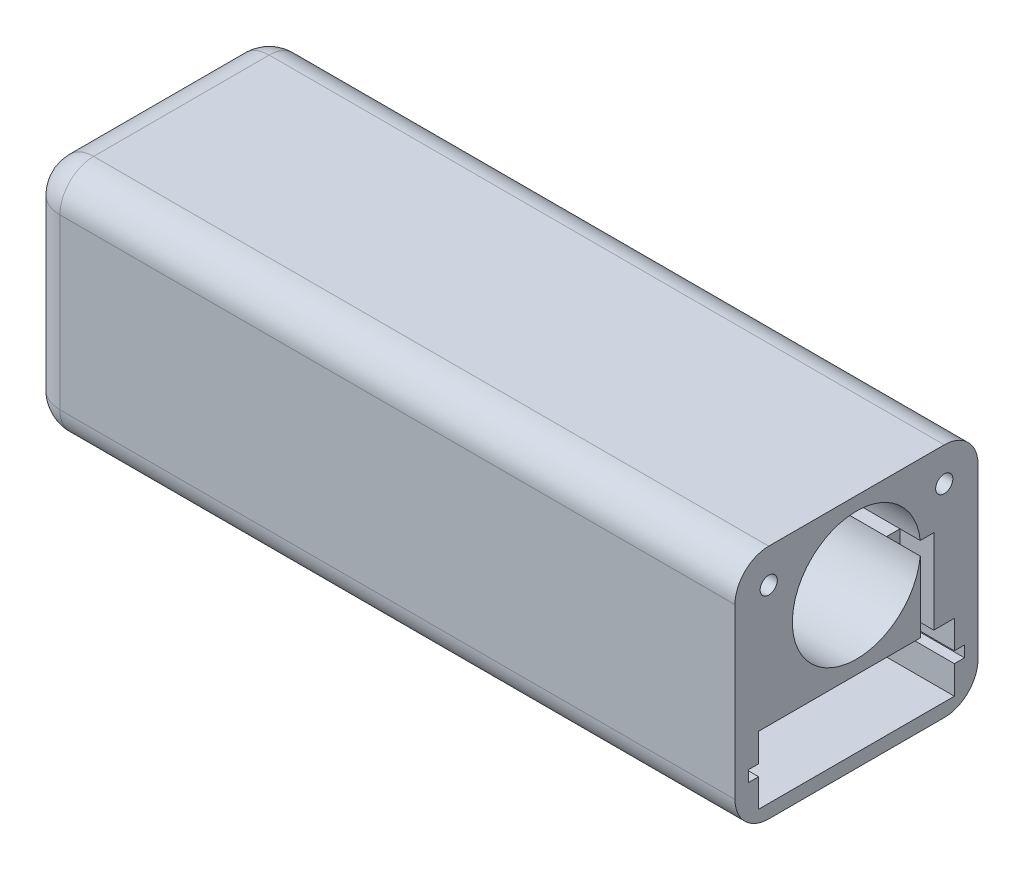
ISO-10303-21;
HEADER;
FILE_DESCRIPTION(('STEP AP214'),'2;1');
FILE_NAME('part.step','',(''),(''),'','','');
FILE_SCHEMA(('AUTOMOTIVE_DESIGN { 1 0 10303 214 1 1 1 1 }'));
ENDSEC;
DATA;
#1=APPLICATION_CONTEXT('core data for automotive mechanical design processes');
#2=APPLICATION_PROTOCOL_DEFINITION('international standard','automotive_design',2000,#1);
#3=PRODUCT_CONTEXT('',#1,'mechanical');
#4=PRODUCT('Part','Part','',(#3));
#5=PRODUCT_RELATED_PRODUCT_CATEGORY('part','',(#4));
#6=PRODUCT_DEFINITION_FORMATION('','',#4);
#7=PRODUCT_DEFINITION_CONTEXT('part definition',#1,'design');
#8=PRODUCT_DEFINITION('design','',#6,#7);
#9=PRODUCT_DEFINITION_SHAPE('','',#8);
#10=(LENGTH_UNIT() NAMED_UNIT(*) SI_UNIT(.MILLI.,.METRE.));
#11=(NAMED_UNIT(*) PLANE_ANGLE_UNIT() SI_UNIT($,.RADIAN.));
#12=(NAMED_UNIT(*) SI_UNIT($,.STERADIAN.) SOLID_ANGLE_UNIT());
#13=UNCERTAINTY_MEASURE_WITH_UNIT(LENGTH_MEASURE(1.E-05),#10,'distance_accuracy_value','');
#14=(GEOMETRIC_REPRESENTATION_CONTEXT(3) GLOBAL_UNCERTAINTY_ASSIGNED_CONTEXT((#13)) GLOBAL_UNIT_ASSIGNED_CONTEXT((#10,
#11,#12)) REPRESENTATION_CONTEXT('',''));
#15=CARTESIAN_POINT('',(0.,0.,0.));
#16=DIRECTION('',(0.,0.,1.));
#17=DIRECTION('',(1.,0.,0.));
#18=AXIS2_PLACEMENT_3D('',#15,#16,#17);
#19=CARTESIAN_POINT('',(105.,0.,0.));
#20=DIRECTION('',(1.,0.,0.));
#21=DIRECTION('',(0.,0.,-1.));
#22=AXIS2_PLACEMENT_3D('',#19,#20,#21);
#23=PLANE('',#22);
#24=CARTESIAN_POINT('',(105.,30.,-5.));
#25=DIRECTION('',(1.,0.,0.));
#26=DIRECTION('',(0.,0.,-1.));
#27=AXIS2_PLACEMENT_3D('',#24,#25,#26);
#28=CIRCLE('',#27,1.27);
#29=CARTESIAN_POINT('',(105.,30.,-6.27));
#30=VERTEX_POINT('',#29);
#31=EDGE_CURVE('E243',#30,#30,#28,.F.);
#32=ORIENTED_EDGE('',*,*,#31,.T.);
#33=EDGE_LOOP('',(#32));
#34=FACE_BOUND('',#33,.T.);
#35=DIRECTION('',(0.,-1.,0.));
#36=VECTOR('',#35,1.);
#37=CARTESIAN_POINT('',(105.,-291558.,-3.50000000003092));
#38=LINE('',#37,#36);
#39=CARTESIAN_POINT('',(105.,11.9999999999825,-3.49999999997408));
#40=VERTEX_POINT('',#39);
#41=CARTESIAN_POINT('',(105.,7.82500000002528,-3.49999999995506));
#42=VERTEX_POINT('',#41);
#43=EDGE_CURVE('E218',#40,#42,#38,.T.);
#44=ORIENTED_EDGE('',*,*,#43,.F.);
#45=DIRECTION('',(0.,0.,-1.));
#46=VECTOR('',#45,1.);
#47=CARTESIAN_POINT('',(105.,11.9999999998868,399982.));
#48=LINE('',#47,#46);
#49=CARTESIAN_POINT('',(105.,11.9999999999769,-27.4472218138726));
#50=VERTEX_POINT('',#49);
#51=EDGE_CURVE('E250',#40,#50,#48,.T.);
#52=ORIENTED_EDGE('',*,*,#51,.T.);
#53=DIRECTION('',(0.,-1.,0.));
#54=VECTOR('',#53,1.);
#55=CARTESIAN_POINT('',(105.,-291529.132234033,-27.4472218138726));
#56=LINE('',#55,#54);
#57=CARTESIAN_POINT('',(105.,22.4999999999795,-27.4472218138726));
#58=VERTEX_POINT('',#57);
#59=EDGE_CURVE('E51',#58,#50,#56,.T.);
#60=ORIENTED_EDGE('',*,*,#59,.F.);
#61=CARTESIAN_POINT('',(105.,23.4999999999825,-18.0000000000007));
#62=DIRECTION('',(1.,0.,0.));
#63=DIRECTION('',(0.,0.,-1.));
#64=AXIS2_PLACEMENT_3D('',#61,#62,#63);
#65=CIRCLE('',#64,9.50000000000909);
#66=CARTESIAN_POINT('',(105.,24.4999999999891,-27.4472218138726));
#67=VERTEX_POINT('',#66);
#68=EDGE_CURVE('E202',#67,#58,#65,.T.);
#69=ORIENTED_EDGE('',*,*,#68,.F.);
#70=DIRECTION('',(0.,0.,-1.));
#71=VECTOR('',#70,1.);
#72=CARTESIAN_POINT('',(105.,24.4999999999891,399982.));
#73=LINE('',#72,#71);
#74=CARTESIAN_POINT('',(105.,24.4999999999891,-29.4472218138822));
#75=VERTEX_POINT('',#74);
#76=EDGE_CURVE('E262',#67,#75,#73,.T.);
#77=ORIENTED_EDGE('',*,*,#76,.T.);
#78=DIRECTION('',(0.,-1.,0.));
#79=VECTOR('',#78,1.);
#80=CARTESIAN_POINT('',(105.,-291563.25,-29.4472218138822));
#81=LINE('',#80,#79);
#82=CARTESIAN_POINT('',(105.,11.9999999999769,-29.4472218138822));
#83=VERTEX_POINT('',#82);
#84=EDGE_CURVE('E265',#75,#83,#81,.T.);
#85=ORIENTED_EDGE('',*,*,#84,.T.);
#86=CARTESIAN_POINT('',(105.,11.9999999999825,-32.5000000000273));
#87=VERTEX_POINT('',#86);
#88=EDGE_CURVE('E281',#83,#87,#48,.T.);
#89=ORIENTED_EDGE('',*,*,#88,.T.);
#90=DIRECTION('',(0.,-1.,0.));
#91=VECTOR('',#90,1.);
#92=CARTESIAN_POINT('',(105.,-291558.,-32.5000000000273));
#93=LINE('',#92,#91);
#94=CARTESIAN_POINT('',(105.,7.82500000002528,-32.5000000000273));
#95=VERTEX_POINT('',#94);
#96=EDGE_CURVE('E254',#87,#95,#93,.T.);
#97=ORIENTED_EDGE('',*,*,#96,.T.);
#98=DIRECTION('',(0.,0.,-1.));
#99=VECTOR('',#98,1.);
#100=CARTESIAN_POINT('',(105.,7.8249999999116,399982.));
#101=LINE('',#100,#99);
#102=CARTESIAN_POINT('',(105.,7.82500000002002,-33.9999999999918));
#103=VERTEX_POINT('',#102);
#104=EDGE_CURVE('E256',#95,#103,#101,.T.);
#105=ORIENTED_EDGE('',*,*,#104,.T.);
#106=DIRECTION('',(0.,-1.,0.));
#107=VECTOR('',#106,1.);
#108=CARTESIAN_POINT('',(105.,-291558.,-33.9999999999918));
#109=LINE('',#108,#107);
#110=CARTESIAN_POINT('',(105.,6.17499999998472,-33.9999999999918));
#111=VERTEX_POINT('',#110);
#112=EDGE_CURVE('E259',#103,#111,#109,.T.);
#113=ORIENTED_EDGE('',*,*,#112,.T.);
#114=DIRECTION('',(0.,0.,-1.));
#115=VECTOR('',#114,1.);
#116=CARTESIAN_POINT('',(105.,6.17499999998472,399982.));
#117=LINE('',#116,#115);
#118=CARTESIAN_POINT('',(105.,6.17499999998472,-32.5000000000273));
#119=VERTEX_POINT('',#118);
#120=EDGE_CURVE('E214',#119,#111,#117,.T.);
#121=ORIENTED_EDGE('',*,*,#120,.F.);
#122=CARTESIAN_POINT('',(105.,1.99999999999158,-32.5000000000273));
#123=VERTEX_POINT('',#122);
#124=EDGE_CURVE('E251',#119,#123,#93,.T.);
#125=ORIENTED_EDGE('',*,*,#124,.T.);
#126=DIRECTION('',(0.,0.,-1.));
#127=VECTOR('',#126,1.);
#128=CARTESIAN_POINT('',(105.,1.99999999989586,399982.));
#129=LINE('',#128,#127);
#130=CARTESIAN_POINT('',(105.,2.00000000000955,-3.49999999995506));
#131=VERTEX_POINT('',#130);
#132=EDGE_CURVE('E192',#131,#123,#129,.T.);
#133=ORIENTED_EDGE('',*,*,#132,.F.);
#134=CARTESIAN_POINT('',(105.,6.17499999998472,-3.49999999995506));
#135=VERTEX_POINT('',#134);
#136=EDGE_CURVE('E181',#135,#131,#38,.T.);
#137=ORIENTED_EDGE('',*,*,#136,.F.);
#138=CARTESIAN_POINT('',(105.,6.17499999998472,-2.00000000000955));
#139=VERTEX_POINT('',#138);
#140=EDGE_CURVE('E215',#139,#135,#117,.T.);
#141=ORIENTED_EDGE('',*,*,#140,.F.);
#142=DIRECTION('',(0.,-1.,0.));
#143=VECTOR('',#142,1.);
#144=CARTESIAN_POINT('',(105.,-291558.,-2.00000000000955));
#145=LINE('',#144,#143);
#146=CARTESIAN_POINT('',(105.,7.82500000002001,-2.00000000000955));
#147=VERTEX_POINT('',#146);
#148=EDGE_CURVE('E154',#147,#139,#145,.T.);
#149=ORIENTED_EDGE('',*,*,#148,.F.);
#150=EDGE_CURVE('E255',#147,#42,#101,.T.);
#151=ORIENTED_EDGE('',*,*,#150,.T.);
#152=EDGE_LOOP('',(#44,#52,#60,#69,#77,#85,#89,#97,#105,#113,#121,#125,#133,#137,#141,#149,#151));
#153=FACE_BOUND('',#152,.T.);
#154=CARTESIAN_POINT('',(105.,30.,-31.));
#155=DIRECTION('',(1.,0.,0.));
#156=DIRECTION('',(0.,0.,-1.));
#157=AXIS2_PLACEMENT_3D('',#154,#155,#156);
#158=CIRCLE('',#157,1.26999999999999);
#159=CARTESIAN_POINT('',(105.,30.,-32.27));
#160=VERTEX_POINT('',#159);
#161=EDGE_CURVE('E247',#160,#160,#158,.F.);
#162=ORIENTED_EDGE('',*,*,#161,.T.);
#163=EDGE_LOOP('',(#162));
#164=FACE_BOUND('',#163,.T.);
#165=CARTESIAN_POINT('',(105.,30.,-31.));
#166=DIRECTION('',(1.,0.,0.));
#167=DIRECTION('',(0.,0.,-1.));
#168=AXIS2_PLACEMENT_3D('',#165,#166,#167);
#169=CIRCLE('',#168,5.);
#170=CARTESIAN_POINT('',(105.,30.,-36.));
#171=VERTEX_POINT('',#170);
#172=CARTESIAN_POINT('',(105.,35.,-31.));
#173=VERTEX_POINT('',#172);
#174=EDGE_CURVE('E269',#171,#173,#169,.T.);
#175=ORIENTED_EDGE('',*,*,#174,.T.);
#176=DIRECTION('',(0.,0.,-1.));
#177=VECTOR('',#176,1.);
#178=CARTESIAN_POINT('',(105.,35.,-36.));
#179=LINE('',#178,#177);
#180=CARTESIAN_POINT('',(105.,35.,-5.));
#181=VERTEX_POINT('',#180);
#182=EDGE_CURVE('E233',#181,#173,#179,.T.);
#183=ORIENTED_EDGE('',*,*,#182,.F.);
#184=CARTESIAN_POINT('',(105.,30.,-5.));
#185=DIRECTION('',(1.,0.,0.));
#186=DIRECTION('',(0.,0.,-1.));
#187=AXIS2_PLACEMENT_3D('',#184,#185,#186);
#188=CIRCLE('',#187,5.);
#189=CARTESIAN_POINT('',(105.,30.,0.));
#190=VERTEX_POINT('',#189);
#191=EDGE_CURVE('E266',#181,#190,#188,.T.);
#192=ORIENTED_EDGE('',*,*,#191,.T.);
#193=DIRECTION('',(0.,-1.,0.));
#194=VECTOR('',#193,1.);
#195=CARTESIAN_POINT('',(105.,35.,0.));
#196=LINE('',#195,#194);
#197=CARTESIAN_POINT('',(105.,5.,0.));
#198=VERTEX_POINT('',#197);
#199=EDGE_CURVE('E228',#198,#190,#196,.F.);
#200=ORIENTED_EDGE('',*,*,#199,.F.);
#201=CARTESIAN_POINT('',(105.,5.,-5.));
#202=DIRECTION('',(1.,0.,0.));
#203=DIRECTION('',(0.,0.,-1.));
#204=AXIS2_PLACEMENT_3D('',#201,#202,#203);
#205=CIRCLE('',#204,5.);
#206=CARTESIAN_POINT('',(105.,0.,-5.));
#207=VERTEX_POINT('',#206);
#208=EDGE_CURVE('E272',#198,#207,#205,.T.);
#209=ORIENTED_EDGE('',*,*,#208,.T.);
#210=DIRECTION('',(0.,0.,-1.));
#211=VECTOR('',#210,1.);
#212=CARTESIAN_POINT('',(105.,0.,0.));
#213=LINE('',#212,#211);
#214=CARTESIAN_POINT('',(105.,0.,-31.));
#215=VERTEX_POINT('',#214);
#216=EDGE_CURVE('E223',#215,#207,#213,.F.);
#217=ORIENTED_EDGE('',*,*,#216,.F.);
#218=CARTESIAN_POINT('',(105.,5.,-31.));
#219=DIRECTION('',(1.,0.,0.));
#220=DIRECTION('',(0.,0.,-1.));
#221=AXIS2_PLACEMENT_3D('',#218,#219,#220);
#222=CIRCLE('',#221,5.);
#223=CARTESIAN_POINT('',(105.,5.,-36.));
#224=VERTEX_POINT('',#223);
#225=EDGE_CURVE('E275',#215,#224,#222,.T.);
#226=ORIENTED_EDGE('',*,*,#225,.T.);
#227=DIRECTION('',(0.,-1.,0.));
#228=VECTOR('',#227,1.);
#229=CARTESIAN_POINT('',(105.,35.,-36.));
#230=LINE('',#229,#228);
#231=EDGE_CURVE('E238',#171,#224,#230,.T.);
#232=ORIENTED_EDGE('',*,*,#231,.F.);
#233=EDGE_LOOP('',(#175,#183,#192,#200,#209,#217,#226,#232));
#234=FACE_BOUND('',#233,.T.);
#235=ADVANCED_FACE('F32',(#34,#153,#164,#234),#23,.T.);
#236=CARTESIAN_POINT('',(-27.0425108254484,11.9999999998868,399982.));
#237=DIRECTION('',(0.,-1.,0.));
#238=DIRECTION('',(0.,0.,-1.));
#239=AXIS2_PLACEMENT_3D('',#236,#237,#238);
#240=PLANE('',#239);
#241=DIRECTION('',(0.,0.,-1.));
#242=VECTOR('',#241,1.);
#243=CARTESIAN_POINT('',(100.,12.0000000013647,399989.26946222));
#244=LINE('',#243,#242);
#245=CARTESIAN_POINT('',(100.,11.9999999999769,-27.4472218138726));
#246=VERTEX_POINT('',#245);
#247=CARTESIAN_POINT('',(100.,11.9999999999769,-29.4472218138822));
#248=VERTEX_POINT('',#247);
#249=EDGE_CURVE('E77',#246,#248,#244,.T.);
#250=ORIENTED_EDGE('',*,*,#249,.F.);
#251=DIRECTION('',(1.,0.,0.));
#252=VECTOR('',#251,1.);
#253=CARTESIAN_POINT('',(100.,11.9999999999769,-27.4472218138726));
#254=LINE('',#253,#252);
#255=EDGE_CURVE('E118',#246,#50,#254,.T.);
#256=ORIENTED_EDGE('',*,*,#255,.T.);
#257=ORIENTED_EDGE('',*,*,#51,.F.);
#258=DIRECTION('',(1.,0.,0.));
#259=VECTOR('',#258,1.);
#260=CARTESIAN_POINT('',(-27.0425108254484,11.9999999999825,-3.49999999997408));
#261=LINE('',#260,#259);
#262=CARTESIAN_POINT('',(4.99999999999999,11.9999999999825,-3.49999999997408));
#263=VERTEX_POINT('',#262);
#264=EDGE_CURVE('E177',#263,#40,#261,.T.);
#265=ORIENTED_EDGE('',*,*,#264,.F.);
#266=DIRECTION('',(0.,0.,-1.));
#267=VECTOR('',#266,1.);
#268=CARTESIAN_POINT('',(5.00000000004898,11.9999999998868,399982.));
#269=LINE('',#268,#267);
#270=CARTESIAN_POINT('',(4.99999999999999,11.9999999999825,-32.5000000000273));
#271=VERTEX_POINT('',#270);
#272=EDGE_CURVE('E189',#263,#271,#269,.T.);
#273=ORIENTED_EDGE('',*,*,#272,.T.);
#274=DIRECTION('',(1.,0.,0.));
#275=VECTOR('',#274,1.);
#276=CARTESIAN_POINT('',(-27.0425108254484,11.9999999999825,-32.5000000000273));
#277=LINE('',#276,#275);
#278=EDGE_CURVE('E169',#271,#87,#277,.T.);
#279=ORIENTED_EDGE('',*,*,#278,.T.);
#280=ORIENTED_EDGE('',*,*,#88,.F.);
#281=DIRECTION('',(1.,0.,0.));
#282=VECTOR('',#281,1.);
#283=CARTESIAN_POINT('',(100.,11.9999999999769,-29.4472218138822));
#284=LINE('',#283,#282);
#285=EDGE_CURVE('E112',#248,#83,#284,.T.);
#286=ORIENTED_EDGE('',*,*,#285,.F.);
#287=EDGE_LOOP('',(#250,#256,#257,#265,#273,#279,#280,#286));
#288=FACE_BOUND('',#287,.T.);
#289=ADVANCED_FACE('F546',(#288),#240,.T.);
#290=CARTESIAN_POINT('',(-27.0425108254484,-291558.,-3.50000000003092));
#291=DIRECTION('',(0.,0.,1.));
#292=DIRECTION('',(0.,-1.,0.));
#293=AXIS2_PLACEMENT_3D('',#290,#291,#292);
#294=PLANE('',#293);
#295=DIRECTION('',(0.,-1.,0.));
#296=VECTOR('',#295,1.);
#297=CARTESIAN_POINT('',(5.,-291558.,-3.50000000003092));
#298=LINE('',#297,#296);
#299=CARTESIAN_POINT('',(5.,7.82500000002528,-3.49999999995506));
#300=VERTEX_POINT('',#299);
#301=EDGE_CURVE('E184',#263,#300,#298,.T.);
#302=ORIENTED_EDGE('',*,*,#301,.F.);
#303=ORIENTED_EDGE('',*,*,#264,.T.);
#304=ORIENTED_EDGE('',*,*,#43,.T.);
#305=DIRECTION('',(1.,0.,0.));
#306=VECTOR('',#305,1.);
#307=CARTESIAN_POINT('',(-27.0425108254484,7.82500000002528,-3.49999999995506));
#308=LINE('',#307,#306);
#309=EDGE_CURVE('E139',#300,#42,#308,.T.);
#310=ORIENTED_EDGE('',*,*,#309,.F.);
#311=EDGE_LOOP('',(#302,#303,#304,#310));
#312=FACE_BOUND('',#311,.T.);
#313=ADVANCED_FACE('F548',(#312),#294,.F.);
#314=CARTESIAN_POINT('',(-27.0425108254484,-291558.,-32.5000000000273));
#315=DIRECTION('',(0.,0.,1.));
#316=DIRECTION('',(1.,0.,0.));
#317=AXIS2_PLACEMENT_3D('',#314,#315,#316);
#318=PLANE('',#317);
#319=DIRECTION('',(1.,0.,0.));
#320=VECTOR('',#319,1.);
#321=CARTESIAN_POINT('',(-27.0425108254484,7.82500000002528,-32.5000000000273));
#322=LINE('',#321,#320);
#323=CARTESIAN_POINT('',(4.99999999999999,7.82500000002528,-32.5000000000273));
#324=VERTEX_POINT('',#323);
#325=EDGE_CURVE('E134',#324,#95,#322,.T.);
#326=ORIENTED_EDGE('',*,*,#325,.T.);
#327=ORIENTED_EDGE('',*,*,#96,.F.);
#328=ORIENTED_EDGE('',*,*,#278,.F.);
#329=DIRECTION('',(0.,-1.,0.));
#330=VECTOR('',#329,1.);
#331=CARTESIAN_POINT('',(4.99999999999999,-291558.,-32.5000000000273));
#332=LINE('',#331,#330);
#333=EDGE_CURVE('E144',#271,#324,#332,.T.);
#334=ORIENTED_EDGE('',*,*,#333,.T.);
#335=EDGE_LOOP('',(#326,#327,#328,#334));
#336=FACE_BOUND('',#335,.T.);
#337=ADVANCED_FACE('F555',(#336),#318,.T.);
#338=DIRECTION('',(1.,0.,0.));
#339=VECTOR('',#338,1.);
#340=CARTESIAN_POINT('',(-27.0425108254484,6.17499999998472,-3.49999999995506));
#341=LINE('',#340,#339);
#342=CARTESIAN_POINT('',(5.,6.17499999998472,-3.49999999995506));
#343=VERTEX_POINT('',#342);
#344=EDGE_CURVE('E136',#343,#135,#341,.T.);
#345=ORIENTED_EDGE('',*,*,#344,.T.);
#346=ORIENTED_EDGE('',*,*,#136,.T.);
#347=DIRECTION('',(1.,0.,0.));
#348=VECTOR('',#347,1.);
#349=CARTESIAN_POINT('',(-27.0425108254484,2.00000000000955,-3.49999999995506));
#350=LINE('',#349,#348);
#351=CARTESIAN_POINT('',(5.,2.00000000000955,-3.49999999995506));
#352=VERTEX_POINT('',#351);
#353=EDGE_CURVE('E180',#352,#131,#350,.T.);
#354=ORIENTED_EDGE('',*,*,#353,.F.);
#355=EDGE_CURVE('E188',#343,#352,#298,.T.);
#356=ORIENTED_EDGE('',*,*,#355,.F.);
#357=EDGE_LOOP('',(#345,#346,#354,#356));
#358=FACE_BOUND('',#357,.T.);
#359=ADVANCED_FACE('F558',(#358),#294,.F.);
#360=CARTESIAN_POINT('',(-27.0425108254484,1.99999999989586,399982.));
#361=DIRECTION('',(0.,-1.,0.));
#362=DIRECTION('',(0.,0.,-1.));
#363=AXIS2_PLACEMENT_3D('',#360,#361,#362);
#364=PLANE('',#363);
#365=ORIENTED_EDGE('',*,*,#353,.T.);
#366=ORIENTED_EDGE('',*,*,#132,.T.);
#367=DIRECTION('',(1.,0.,0.));
#368=VECTOR('',#367,1.);
#369=CARTESIAN_POINT('',(-27.0425108254484,1.99999999999158,-32.5000000000273));
#370=LINE('',#369,#368);
#371=CARTESIAN_POINT('',(4.99999999999999,1.99999999999158,-32.5000000000273));
#372=VERTEX_POINT('',#371);
#373=EDGE_CURVE('E185',#372,#123,#370,.T.);
#374=ORIENTED_EDGE('',*,*,#373,.F.);
#375=DIRECTION('',(0.,0.,-1.));
#376=VECTOR('',#375,1.);
#377=CARTESIAN_POINT('',(5.00000000004898,1.99999999989586,399982.));
#378=LINE('',#377,#376);
#379=EDGE_CURVE('E176',#352,#372,#378,.T.);
#380=ORIENTED_EDGE('',*,*,#379,.F.);
#381=EDGE_LOOP('',(#365,#366,#374,#380));
#382=FACE_BOUND('',#381,.T.);
#383=ADVANCED_FACE('F883',(#382),#364,.F.);
#384=CARTESIAN_POINT('',(4.99999999999999,6.17499999998472,-32.5000000000273));
#385=VERTEX_POINT('',#384);
#386=EDGE_CURVE('E193',#385,#372,#332,.T.);
#387=ORIENTED_EDGE('',*,*,#386,.T.);
#388=ORIENTED_EDGE('',*,*,#373,.T.);
#389=ORIENTED_EDGE('',*,*,#124,.F.);
#390=DIRECTION('',(1.,0.,0.));
#391=VECTOR('',#390,1.);
#392=CARTESIAN_POINT('',(-27.0425108254484,6.17499999998472,-32.5000000000273));
#393=LINE('',#392,#391);
#394=EDGE_CURVE('E131',#385,#119,#393,.T.);
#395=ORIENTED_EDGE('',*,*,#394,.F.);
#396=EDGE_LOOP('',(#387,#388,#389,#395));
#397=FACE_BOUND('',#396,.T.);
#398=ADVANCED_FACE('F874',(#397),#318,.T.);
#399=CARTESIAN_POINT('',(5.,0.,0.));
#400=DIRECTION('',(-1.,0.,0.));
#401=DIRECTION('',(0.,0.,1.));
#402=AXIS2_PLACEMENT_3D('',#399,#400,#401);
#403=PLANE('',#402);
#404=ORIENTED_EDGE('',*,*,#355,.T.);
#405=ORIENTED_EDGE('',*,*,#379,.T.);
#406=ORIENTED_EDGE('',*,*,#386,.F.);
#407=DIRECTION('',(0.,0.,-1.));
#408=VECTOR('',#407,1.);
#409=CARTESIAN_POINT('',(5.00000000004898,6.17499999998472,399982.));
#410=LINE('',#409,#408);
#411=CARTESIAN_POINT('',(4.99999999999999,6.17499999998472,-33.9999999999918));
#412=VERTEX_POINT('',#411);
#413=EDGE_CURVE('E149',#385,#412,#410,.T.);
#414=ORIENTED_EDGE('',*,*,#413,.T.);
#415=DIRECTION('',(0.,-1.,0.));
#416=VECTOR('',#415,1.);
#417=CARTESIAN_POINT('',(4.99999999999999,-291558.,-33.9999999999918));
#418=LINE('',#417,#416);
#419=CARTESIAN_POINT('',(4.99999999999999,7.82500000002002,-33.9999999999918));
#420=VERTEX_POINT('',#419);
#421=EDGE_CURVE('E166',#420,#412,#418,.T.);
#422=ORIENTED_EDGE('',*,*,#421,.F.);
#423=DIRECTION('',(0.,0.,-1.));
#424=VECTOR('',#423,1.);
#425=CARTESIAN_POINT('',(5.00000000004898,7.8249999999116,399982.));
#426=LINE('',#425,#424);
#427=EDGE_CURVE('E165',#324,#420,#426,.T.);
#428=ORIENTED_EDGE('',*,*,#427,.F.);
#429=ORIENTED_EDGE('',*,*,#333,.F.);
#430=ORIENTED_EDGE('',*,*,#272,.F.);
#431=ORIENTED_EDGE('',*,*,#301,.T.);
#432=CARTESIAN_POINT('',(4.99999999999999,7.82500000002001,-2.00000000000955));
#433=VERTEX_POINT('',#432);
#434=EDGE_CURVE('E162',#433,#300,#426,.T.);
#435=ORIENTED_EDGE('',*,*,#434,.F.);
#436=DIRECTION('',(0.,-1.,0.));
#437=VECTOR('',#436,1.);
#438=CARTESIAN_POINT('',(5.,-291558.,-2.00000000000955));
#439=LINE('',#438,#437);
#440=CARTESIAN_POINT('',(5.,6.17499999998472,-2.00000000000955));
#441=VERTEX_POINT('',#440);
#442=EDGE_CURVE('E157',#433,#441,#439,.T.);
#443=ORIENTED_EDGE('',*,*,#442,.T.);
#444=EDGE_CURVE('E161',#441,#343,#410,.T.);
#445=ORIENTED_EDGE('',*,*,#444,.T.);
#446=EDGE_LOOP('',(#404,#405,#406,#414,#422,#428,#429,#430,#431,#435,#443,#445));
#447=FACE_BOUND('',#446,.T.);
#448=ADVANCED_FACE('F865',(#447),#403,.F.);
#449=CARTESIAN_POINT('',(-27.0425108254484,-291558.,-2.00000000000955));
#450=DIRECTION('',(0.,0.,1.));
#451=DIRECTION('',(1.,0.,0.));
#452=AXIS2_PLACEMENT_3D('',#449,#450,#451);
#453=PLANE('',#452);
#454=DIRECTION('',(1.,0.,0.));
#455=VECTOR('',#454,1.);
#456=CARTESIAN_POINT('',(-27.0425108254484,7.82500000002001,-2.00000000000955));
#457=LINE('',#456,#455);
#458=EDGE_CURVE('E150',#433,#147,#457,.T.);
#459=ORIENTED_EDGE('',*,*,#458,.T.);
#460=ORIENTED_EDGE('',*,*,#148,.T.);
#461=DIRECTION('',(1.,0.,0.));
#462=VECTOR('',#461,1.);
#463=CARTESIAN_POINT('',(-27.0425108254484,6.17499999998472,-2.00000000000955));
#464=LINE('',#463,#462);
#465=EDGE_CURVE('E153',#441,#139,#464,.T.);
#466=ORIENTED_EDGE('',*,*,#465,.F.);
#467=ORIENTED_EDGE('',*,*,#442,.F.);
#468=EDGE_LOOP('',(#459,#460,#466,#467));
#469=FACE_BOUND('',#468,.T.);
#470=ADVANCED_FACE('F857',(#469),#453,.F.);
#471=CARTESIAN_POINT('',(-27.0425108254484,6.17499999998472,399982.));
#472=DIRECTION('',(0.,-1.,0.));
#473=DIRECTION('',(0.,0.,-1.));
#474=AXIS2_PLACEMENT_3D('',#471,#472,#473);
#475=PLANE('',#474);
#476=ORIENTED_EDGE('',*,*,#444,.F.);
#477=ORIENTED_EDGE('',*,*,#465,.T.);
#478=ORIENTED_EDGE('',*,*,#140,.T.);
#479=ORIENTED_EDGE('',*,*,#344,.F.);
#480=EDGE_LOOP('',(#476,#477,#478,#479));
#481=FACE_BOUND('',#480,.T.);
#482=ADVANCED_FACE('F843',(#481),#475,.F.);
#483=CARTESIAN_POINT('',(-27.0425108254484,7.8249999999116,399982.));
#484=DIRECTION('',(0.,-1.,0.));
#485=DIRECTION('',(0.,0.,-1.));
#486=AXIS2_PLACEMENT_3D('',#483,#484,#485);
#487=PLANE('',#486);
#488=ORIENTED_EDGE('',*,*,#309,.T.);
#489=ORIENTED_EDGE('',*,*,#150,.F.);
#490=ORIENTED_EDGE('',*,*,#458,.F.);
#491=ORIENTED_EDGE('',*,*,#434,.T.);
#492=EDGE_LOOP('',(#488,#489,#490,#491));
#493=FACE_BOUND('',#492,.T.);
#494=ADVANCED_FACE('F826',(#493),#487,.T.);
#495=ORIENTED_EDGE('',*,*,#394,.T.);
#496=ORIENTED_EDGE('',*,*,#120,.T.);
#497=DIRECTION('',(1.,0.,0.));
#498=VECTOR('',#497,1.);
#499=CARTESIAN_POINT('',(-27.0425108254484,6.17499999998472,-33.9999999999918));
#500=LINE('',#499,#498);
#501=EDGE_CURVE('E158',#412,#111,#500,.T.);
#502=ORIENTED_EDGE('',*,*,#501,.F.);
#503=ORIENTED_EDGE('',*,*,#413,.F.);
#504=EDGE_LOOP('',(#495,#496,#502,#503));
#505=FACE_BOUND('',#504,.T.);
#506=ADVANCED_FACE('F827',(#505),#475,.F.);
#507=CARTESIAN_POINT('',(-27.0425108254484,-291558.,-33.9999999999918));
#508=DIRECTION('',(0.,0.,1.));
#509=DIRECTION('',(1.,0.,0.));
#510=AXIS2_PLACEMENT_3D('',#507,#508,#509);
#511=PLANE('',#510);
#512=ORIENTED_EDGE('',*,*,#421,.T.);
#513=ORIENTED_EDGE('',*,*,#501,.T.);
#514=ORIENTED_EDGE('',*,*,#112,.F.);
#515=DIRECTION('',(1.,0.,0.));
#516=VECTOR('',#515,1.);
#517=CARTESIAN_POINT('',(-27.0425108254484,7.82500000002002,-33.9999999999918));
#518=LINE('',#517,#516);
#519=EDGE_CURVE('E145',#420,#103,#518,.T.);
#520=ORIENTED_EDGE('',*,*,#519,.F.);
#521=EDGE_LOOP('',(#512,#513,#514,#520));
#522=FACE_BOUND('',#521,.T.);
#523=ADVANCED_FACE('F587',(#522),#511,.T.);
#524=ORIENTED_EDGE('',*,*,#427,.T.);
#525=ORIENTED_EDGE('',*,*,#519,.T.);
#526=ORIENTED_EDGE('',*,*,#104,.F.);
#527=ORIENTED_EDGE('',*,*,#325,.F.);
#528=EDGE_LOOP('',(#524,#525,#526,#527));
#529=FACE_BOUND('',#528,.T.);
#530=ADVANCED_FACE('F586',(#529),#487,.T.);
#531=CARTESIAN_POINT('',(100.,-291529.132234033,-27.4472218138726));
#532=DIRECTION('',(0.,0.,1.));
#533=DIRECTION('',(1.,0.,0.));
#534=AXIS2_PLACEMENT_3D('',#531,#532,#533);
#535=PLANE('',#534);
#536=ORIENTED_EDGE('',*,*,#59,.T.);
#537=ORIENTED_EDGE('',*,*,#255,.F.);
#538=DIRECTION('',(0.,-1.,0.));
#539=VECTOR('',#538,1.);
#540=CARTESIAN_POINT('',(100.,-291529.132234033,-27.4472218138726));
#541=LINE('',#540,#539);
#542=CARTESIAN_POINT('',(100.,22.4999999999795,-27.4472218138726));
#543=VERTEX_POINT('',#542);
#544=EDGE_CURVE('E64',#543,#246,#541,.T.);
#545=ORIENTED_EDGE('',*,*,#544,.F.);
#546=DIRECTION('',(1.,0.,0.));
#547=VECTOR('',#546,1.);
#548=CARTESIAN_POINT('',(100.,22.4999999999795,-27.4472218138726));
#549=LINE('',#548,#547);
#550=EDGE_CURVE('E116',#543,#58,#549,.T.);
#551=ORIENTED_EDGE('',*,*,#550,.T.);
#552=EDGE_LOOP('',(#536,#537,#545,#551));
#553=FACE_BOUND('',#552,.T.);
#554=ADVANCED_FACE('F583',(#553),#535,.F.);
#555=CARTESIAN_POINT('',(100.,0.,0.));
#556=DIRECTION('',(1.,0.,0.));
#557=DIRECTION('',(0.,0.,-1.));
#558=AXIS2_PLACEMENT_3D('',#555,#556,#557);
#559=PLANE('',#558);
#560=DIRECTION('',(0.,1.,0.));
#561=VECTOR('',#560,1.);
#562=CARTESIAN_POINT('',(100.,-291529.132234033,-29.4472218138822));
#563=LINE('',#562,#561);
#564=CARTESIAN_POINT('',(100.,22.4999999999795,-29.4472218138822));
#565=VERTEX_POINT('',#564);
#566=EDGE_CURVE('E70',#248,#565,#563,.T.);
#567=ORIENTED_EDGE('',*,*,#566,.T.);
#568=DIRECTION('',(0.,0.,1.));
#569=VECTOR('',#568,1.);
#570=CARTESIAN_POINT('',(100.,22.4999999999795,399989.269462221));
#571=LINE('',#570,#569);
#572=EDGE_CURVE('E73',#565,#543,#571,.T.);
#573=ORIENTED_EDGE('',*,*,#572,.T.);
#574=ORIENTED_EDGE('',*,*,#544,.T.);
#575=ORIENTED_EDGE('',*,*,#249,.T.);
#576=EDGE_LOOP('',(#567,#573,#574,#575));
#577=FACE_BOUND('',#576,.T.);
#578=ADVANCED_FACE('F72',(#577),#559,.T.);
#579=CARTESIAN_POINT('',(27.1715728752403,22.4999999999795,399982.));
#580=DIRECTION('',(0.,1.,0.));
#581=DIRECTION('',(0.,0.,1.));
#582=AXIS2_PLACEMENT_3D('',#579,#580,#581);
#583=PLANE('',#582);
#584=DIRECTION('',(1.,0.,0.));
#585=VECTOR('',#584,1.);
#586=CARTESIAN_POINT('',(27.1715728752403,22.4999999999795,-27.4472218138726));
#587=LINE('',#586,#585);
#588=CARTESIAN_POINT('',(30.,22.4999999999795,-27.4472218138726));
#589=VERTEX_POINT('',#588);
#590=EDGE_CURVE('E91',#589,#543,#587,.T.);
#591=ORIENTED_EDGE('',*,*,#590,.T.);
#592=ORIENTED_EDGE('',*,*,#572,.F.);
#593=DIRECTION('',(1.,0.,0.));
#594=VECTOR('',#593,1.);
#595=CARTESIAN_POINT('',(27.1715728752403,22.4999999999795,-29.4472218138822));
#596=LINE('',#595,#594);
#597=CARTESIAN_POINT('',(30.,22.4999999999795,-29.4472218138822));
#598=VERTEX_POINT('',#597);
#599=EDGE_CURVE('E88',#598,#565,#596,.T.);
#600=ORIENTED_EDGE('',*,*,#599,.F.);
#601=DIRECTION('',(0.,0.,-1.));
#602=VECTOR('',#601,1.);
#603=CARTESIAN_POINT('',(30.,22.4999999999795,399982.));
#604=LINE('',#603,#602);
#605=EDGE_CURVE('E103',#589,#598,#604,.T.);
#606=ORIENTED_EDGE('',*,*,#605,.F.);
#607=EDGE_LOOP('',(#591,#592,#600,#606));
#608=FACE_BOUND('',#607,.T.);
#609=ADVANCED_FACE('F86',(#608),#583,.T.);
#610=CARTESIAN_POINT('',(30.,23.4999999999825,-18.0000000000007));
#611=DIRECTION('',(1.,0.,0.));
#612=DIRECTION('',(0.,0.,-1.));
#613=AXIS2_PLACEMENT_3D('',#610,#611,#612);
#614=CYLINDRICAL_SURFACE('',#613,9.50000000000909);
#615=DIRECTION('',(1.,0.,0.));
#616=VECTOR('',#615,1.);
#617=CARTESIAN_POINT('',(27.1715728752403,24.4999999999891,-27.4472218138726));
#618=LINE('',#617,#616);
#619=CARTESIAN_POINT('',(30.,24.4999999998201,-27.4472218138726));
#620=VERTEX_POINT('',#619);
#621=EDGE_CURVE('E100',#620,#67,#618,.T.);
#622=ORIENTED_EDGE('',*,*,#621,.T.);
#623=ORIENTED_EDGE('',*,*,#68,.T.);
#624=ORIENTED_EDGE('',*,*,#550,.F.);
#625=ORIENTED_EDGE('',*,*,#590,.F.);
#626=CARTESIAN_POINT('',(30.,23.4999999999825,-18.0000000000007));
#627=DIRECTION('',(1.,0.,0.));
#628=DIRECTION('',(0.,0.,-1.));
#629=AXIS2_PLACEMENT_3D('',#626,#627,#628);
#630=CIRCLE('',#629,9.50000000000909);
#631=EDGE_CURVE('E148',#620,#589,#630,.T.);
#632=ORIENTED_EDGE('',*,*,#631,.F.);
#633=EDGE_LOOP('',(#622,#623,#624,#625,#632));
#634=FACE_BOUND('',#633,.T.);
#635=ADVANCED_FACE('F564',(#634),#614,.F.);
#636=CARTESIAN_POINT('',(30.,23.4999999999825,-18.0000000000007));
#637=DIRECTION('',(1.,0.,0.));
#638=DIRECTION('',(0.,0.,-1.));
#639=AXIS2_PLACEMENT_3D('',#636,#637,#638);
#640=PLANE('',#639);
#641=ORIENTED_EDGE('',*,*,#631,.T.);
#642=ORIENTED_EDGE('',*,*,#605,.T.);
#643=DIRECTION('',(0.,1.,0.));
#644=VECTOR('',#643,1.);
#645=CARTESIAN_POINT('',(30.,-291563.25,-29.4472218138822));
#646=LINE('',#645,#644);
#647=CARTESIAN_POINT('',(30.,24.4999999999891,-29.4472218138822));
#648=VERTEX_POINT('',#647);
#649=EDGE_CURVE('E97',#598,#648,#646,.T.);
#650=ORIENTED_EDGE('',*,*,#649,.T.);
#651=DIRECTION('',(0.,0.,1.));
#652=VECTOR('',#651,1.);
#653=CARTESIAN_POINT('',(30.,24.4999999999891,399982.));
#654=LINE('',#653,#652);
#655=EDGE_CURVE('E98',#648,#620,#654,.T.);
#656=ORIENTED_EDGE('',*,*,#655,.T.);
#657=EDGE_LOOP('',(#641,#642,#650,#656));
#658=FACE_BOUND('',#657,.T.);
#659=CARTESIAN_POINT('',(30.,23.4999999999825,-18.0000000000007));
#660=DIRECTION('',(1.,0.,0.));
#661=DIRECTION('',(0.,0.,-1.));
#662=AXIS2_PLACEMENT_3D('',#659,#660,#661);
#663=CIRCLE('',#662,1.27);
#664=CARTESIAN_POINT('',(30.,23.4999999999825,-19.2700000000007));
#665=VERTEX_POINT('',#664);
#666=EDGE_CURVE('E114',#665,#665,#663,.T.);
#667=ORIENTED_EDGE('',*,*,#666,.F.);
#668=EDGE_LOOP('',(#667));
#669=FACE_BOUND('',#668,.T.);
#670=ADVANCED_FACE('F488',(#658,#669),#640,.T.);
#671=CARTESIAN_POINT('',(20.,23.4999999999825,-18.0000000000007));
#672=DIRECTION('',(1.,0.,0.));
#673=DIRECTION('',(0.,0.,-1.));
#674=AXIS2_PLACEMENT_3D('',#671,#672,#673);
#675=CYLINDRICAL_SURFACE('',#674,1.27);
#676=CARTESIAN_POINT('',(20.,23.4999999999825,-18.0000000000007));
#677=DIRECTION('',(1.,0.,0.));
#678=DIRECTION('',(0.,0.,-1.));
#679=AXIS2_PLACEMENT_3D('',#676,#677,#678);
#680=CIRCLE('',#679,1.27);
#681=CARTESIAN_POINT('',(20.,23.4999999999825,-19.2700000000007));
#682=VERTEX_POINT('',#681);
#683=EDGE_CURVE('E204',#682,#682,#680,.T.);
#684=ORIENTED_EDGE('',*,*,#683,.F.);
#685=EDGE_LOOP('',(#684));
#686=FACE_BOUND('',#685,.T.);
#687=ORIENTED_EDGE('',*,*,#666,.T.);
#688=EDGE_LOOP('',(#687));
#689=FACE_BOUND('',#688,.T.);
#690=ADVANCED_FACE('F569',(#686,#689),#675,.F.);
#691=CARTESIAN_POINT('',(20.,23.4999999999825,-18.0000000000007));
#692=DIRECTION('',(1.,0.,0.));
#693=DIRECTION('',(0.,0.,-1.));
#694=AXIS2_PLACEMENT_3D('',#691,#692,#693);
#695=PLANE('',#694);
#696=ORIENTED_EDGE('',*,*,#683,.T.);
#697=EDGE_LOOP('',(#696));
#698=FACE_BOUND('',#697,.T.);
#699=ADVANCED_FACE('F572',(#698),#695,.T.);
#700=CARTESIAN_POINT('',(27.1715728752403,24.4999999999891,399982.));
#701=DIRECTION('',(0.,-1.,0.));
#702=DIRECTION('',(0.,0.,-1.));
#703=AXIS2_PLACEMENT_3D('',#700,#701,#702);
#704=PLANE('',#703);
#705=DIRECTION('',(1.,0.,0.));
#706=VECTOR('',#705,1.);
#707=CARTESIAN_POINT('',(27.1715728752403,24.4999999999891,-29.4472218138822));
#708=LINE('',#707,#706);
#709=EDGE_CURVE('E109',#648,#75,#708,.T.);
#710=ORIENTED_EDGE('',*,*,#709,.T.);
#711=ORIENTED_EDGE('',*,*,#76,.F.);
#712=ORIENTED_EDGE('',*,*,#621,.F.);
#713=ORIENTED_EDGE('',*,*,#655,.F.);
#714=EDGE_LOOP('',(#710,#711,#712,#713));
#715=FACE_BOUND('',#714,.T.);
#716=ADVANCED_FACE('F483',(#715),#704,.T.);
#717=CARTESIAN_POINT('',(27.1715728752403,-291563.25,-29.4472218138822));
#718=DIRECTION('',(0.,0.,1.));
#719=DIRECTION('',(1.,0.,0.));
#720=AXIS2_PLACEMENT_3D('',#717,#718,#719);
#721=PLANE('',#720);
#722=ORIENTED_EDGE('',*,*,#599,.T.);
#723=ORIENTED_EDGE('',*,*,#566,.F.);
#724=ORIENTED_EDGE('',*,*,#285,.T.);
#725=ORIENTED_EDGE('',*,*,#84,.F.);
#726=ORIENTED_EDGE('',*,*,#709,.F.);
#727=ORIENTED_EDGE('',*,*,#649,.F.);
#728=EDGE_LOOP('',(#722,#723,#724,#725,#726,#727));
#729=FACE_BOUND('',#728,.T.);
#730=ADVANCED_FACE('F94',(#729),#721,.T.);
#731=CARTESIAN_POINT('',(90.,30.,-31.));
#732=DIRECTION('',(1.,0.,0.));
#733=DIRECTION('',(0.,0.,-1.));
#734=AXIS2_PLACEMENT_3D('',#731,#732,#733);
#735=PLANE('',#734);
#736=CARTESIAN_POINT('',(90.,30.,-31.));
#737=DIRECTION('',(1.,0.,0.));
#738=DIRECTION('',(0.,0.,-1.));
#739=AXIS2_PLACEMENT_3D('',#736,#737,#738);
#740=CIRCLE('',#739,1.26999999999999);
#741=CARTESIAN_POINT('',(90.,30.,-32.27));
#742=VERTEX_POINT('',#741);
#743=EDGE_CURVE('E11',#742,#742,#740,.T.);
#744=ORIENTED_EDGE('',*,*,#743,.T.);
#745=EDGE_LOOP('',(#744));
#746=FACE_BOUND('',#745,.T.);
#747=ADVANCED_FACE('F578',(#746),#735,.T.);
#748=CARTESIAN_POINT('',(90.,30.,-31.));
#749=DIRECTION('',(1.,0.,0.));
#750=DIRECTION('',(0.,0.,-1.));
#751=AXIS2_PLACEMENT_3D('',#748,#749,#750);
#752=CYLINDRICAL_SURFACE('',#751,1.26999999999999);
#753=ORIENTED_EDGE('',*,*,#743,.F.);
#754=EDGE_LOOP('',(#753));
#755=FACE_BOUND('',#754,.T.);
#756=ORIENTED_EDGE('',*,*,#161,.F.);
#757=EDGE_LOOP('',(#756));
#758=FACE_BOUND('',#757,.T.);
#759=ADVANCED_FACE('F593',(#755,#758),#752,.F.);
#760=CARTESIAN_POINT('',(90.,30.,-5.));
#761=DIRECTION('',(1.,0.,0.));
#762=DIRECTION('',(0.,0.,-1.));
#763=AXIS2_PLACEMENT_3D('',#760,#761,#762);
#764=PLANE('',#763);
#765=CARTESIAN_POINT('',(90.,30.,-5.));
#766=DIRECTION('',(1.,0.,0.));
#767=DIRECTION('',(0.,0.,-1.));
#768=AXIS2_PLACEMENT_3D('',#765,#766,#767);
#769=CIRCLE('',#768,1.27);
#770=CARTESIAN_POINT('',(90.,30.,-6.27));
#771=VERTEX_POINT('',#770);
#772=EDGE_CURVE('E42',#771,#771,#769,.T.);
#773=ORIENTED_EDGE('',*,*,#772,.T.);
#774=EDGE_LOOP('',(#773));
#775=FACE_BOUND('',#774,.T.);
#776=ADVANCED_FACE('F590',(#775),#764,.T.);
#777=CARTESIAN_POINT('',(90.,30.,-5.));
#778=DIRECTION('',(1.,0.,0.));
#779=DIRECTION('',(0.,0.,-1.));
#780=AXIS2_PLACEMENT_3D('',#777,#778,#779);
#781=CYLINDRICAL_SURFACE('',#780,1.27);
#782=ORIENTED_EDGE('',*,*,#772,.F.);
#783=EDGE_LOOP('',(#782));
#784=FACE_BOUND('',#783,.T.);
#785=ORIENTED_EDGE('',*,*,#31,.F.);
#786=EDGE_LOOP('',(#785));
#787=FACE_BOUND('',#786,.T.);
#788=ADVANCED_FACE('F34',(#784,#787),#781,.F.);
#789=CARTESIAN_POINT('',(0.,35.,-36.));
#790=DIRECTION('',(1.,0.,0.));
#791=DIRECTION('',(0.,0.,-1.));
#792=AXIS2_PLACEMENT_3D('',#789,#790,#791);
#793=PLANE('',#792);
#794=DIRECTION('',(0.,0.,1.));
#795=VECTOR('',#794,1.);
#796=CARTESIAN_POINT('',(0.,30.,-36.));
#797=LINE('',#796,#795);
#798=CARTESIAN_POINT('',(0.,30.,-5.));
#799=VERTEX_POINT('',#798);
#800=CARTESIAN_POINT('',(0.,30.,-31.));
#801=VERTEX_POINT('',#800);
#802=EDGE_CURVE('E242',#799,#801,#797,.F.);
#803=ORIENTED_EDGE('',*,*,#802,.T.);
#804=DIRECTION('',(0.,-1.,0.));
#805=VECTOR('',#804,1.);
#806=CARTESIAN_POINT('',(0.,35.,-31.));
#807=LINE('',#806,#805);
#808=CARTESIAN_POINT('',(0.,5.,-31.));
#809=VERTEX_POINT('',#808);
#810=EDGE_CURVE('E246',#801,#809,#807,.T.);
#811=ORIENTED_EDGE('',*,*,#810,.T.);
#812=DIRECTION('',(0.,0.,1.));
#813=VECTOR('',#812,1.);
#814=CARTESIAN_POINT('',(0.,5.,-36.));
#815=LINE('',#814,#813);
#816=CARTESIAN_POINT('',(0.,5.,-5.));
#817=VERTEX_POINT('',#816);
#818=EDGE_CURVE('E323',#809,#817,#815,.T.);
#819=ORIENTED_EDGE('',*,*,#818,.T.);
#820=DIRECTION('',(0.,-1.,0.));
#821=VECTOR('',#820,1.);
#822=CARTESIAN_POINT('',(0.,35.,-5.));
#823=LINE('',#822,#821);
#824=EDGE_CURVE('E326',#817,#799,#823,.F.);
#825=ORIENTED_EDGE('',*,*,#824,.T.);
#826=EDGE_LOOP('',(#803,#811,#819,#825));
#827=FACE_BOUND('',#826,.T.);
#828=ADVANCED_FACE('F616',(#827),#793,.F.);
#829=CARTESIAN_POINT('',(0.,35.,0.));
#830=DIRECTION('',(0.,0.,-1.));
#831=DIRECTION('',(-1.,0.,0.));
#832=AXIS2_PLACEMENT_3D('',#829,#830,#831);
#833=PLANE('',#832);
#834=DIRECTION('',(1.,0.,0.));
#835=VECTOR('',#834,1.);
#836=CARTESIAN_POINT('',(0.,5.,0.));
#837=LINE('',#836,#835);
#838=CARTESIAN_POINT('',(5.,5.,0.));
#839=VERTEX_POINT('',#838);
#840=EDGE_CURVE('E231',#839,#198,#837,.T.);
#841=ORIENTED_EDGE('',*,*,#840,.T.);
#842=ORIENTED_EDGE('',*,*,#199,.T.);
#843=DIRECTION('',(1.,0.,0.));
#844=VECTOR('',#843,1.);
#845=CARTESIAN_POINT('',(0.,30.,0.));
#846=LINE('',#845,#844);
#847=CARTESIAN_POINT('',(5.,30.,0.));
#848=VERTEX_POINT('',#847);
#849=EDGE_CURVE('E227',#190,#848,#846,.F.);
#850=ORIENTED_EDGE('',*,*,#849,.T.);
#851=DIRECTION('',(0.,-1.,0.));
#852=VECTOR('',#851,1.);
#853=CARTESIAN_POINT('',(5.,35.,0.));
#854=LINE('',#853,#852);
#855=EDGE_CURVE('E347',#848,#839,#854,.T.);
#856=ORIENTED_EDGE('',*,*,#855,.T.);
#857=EDGE_LOOP('',(#841,#842,#850,#856));
#858=FACE_BOUND('',#857,.T.);
#859=ADVANCED_FACE('F388',(#858),#833,.F.);
#860=CARTESIAN_POINT('',(0.,35.,-36.));
#861=DIRECTION('',(0.,0.,1.));
#862=DIRECTION('',(1.,0.,0.));
#863=AXIS2_PLACEMENT_3D('',#860,#861,#862);
#864=PLANE('',#863);
#865=DIRECTION('',(-1.,0.,0.));
#866=VECTOR('',#865,1.);
#867=CARTESIAN_POINT('',(110.,30.,-36.));
#868=LINE('',#867,#866);
#869=CARTESIAN_POINT('',(5.,30.,-36.));
#870=VERTEX_POINT('',#869);
#871=EDGE_CURVE('E333',#870,#171,#868,.F.);
#872=ORIENTED_EDGE('',*,*,#871,.T.);
#873=ORIENTED_EDGE('',*,*,#231,.T.);
#874=DIRECTION('',(-1.,0.,0.));
#875=VECTOR('',#874,1.);
#876=CARTESIAN_POINT('',(0.,5.,-36.));
#877=LINE('',#876,#875);
#878=CARTESIAN_POINT('',(5.,5.,-36.));
#879=VERTEX_POINT('',#878);
#880=EDGE_CURVE('E241',#224,#879,#877,.T.);
#881=ORIENTED_EDGE('',*,*,#880,.T.);
#882=DIRECTION('',(0.,-1.,0.));
#883=VECTOR('',#882,1.);
#884=CARTESIAN_POINT('',(5.,35.,-36.));
#885=LINE('',#884,#883);
#886=EDGE_CURVE('E237',#879,#870,#885,.F.);
#887=ORIENTED_EDGE('',*,*,#886,.T.);
#888=EDGE_LOOP('',(#872,#873,#881,#887));
#889=FACE_BOUND('',#888,.T.);
#890=ADVANCED_FACE('F528',(#889),#864,.F.);
#891=CARTESIAN_POINT('',(0.,35.,0.));
#892=DIRECTION('',(0.,1.,0.));
#893=DIRECTION('',(0.,0.,1.));
#894=AXIS2_PLACEMENT_3D('',#891,#892,#893);
#895=PLANE('',#894);
#896=DIRECTION('',(1.,0.,0.));
#897=VECTOR('',#896,1.);
#898=CARTESIAN_POINT('',(110.,35.,-5.));
#899=LINE('',#898,#897);
#900=CARTESIAN_POINT('',(5.,35.,-5.));
#901=VERTEX_POINT('',#900);
#902=EDGE_CURVE('E232',#901,#181,#899,.T.);
#903=ORIENTED_EDGE('',*,*,#902,.T.);
#904=ORIENTED_EDGE('',*,*,#182,.T.);
#905=DIRECTION('',(-1.,0.,0.));
#906=VECTOR('',#905,1.);
#907=CARTESIAN_POINT('',(0.,35.,-31.));
#908=LINE('',#907,#906);
#909=CARTESIAN_POINT('',(5.,35.,-31.));
#910=VERTEX_POINT('',#909);
#911=EDGE_CURVE('E236',#173,#910,#908,.T.);
#912=ORIENTED_EDGE('',*,*,#911,.T.);
#913=DIRECTION('',(0.,0.,1.));
#914=VECTOR('',#913,1.);
#915=CARTESIAN_POINT('',(5.,35.,0.));
#916=LINE('',#915,#914);
#917=EDGE_CURVE('E340',#910,#901,#916,.T.);
#918=ORIENTED_EDGE('',*,*,#917,.T.);
#919=EDGE_LOOP('',(#903,#904,#912,#918));
#920=FACE_BOUND('',#919,.T.);
#921=ADVANCED_FACE('F535',(#920),#895,.T.);
#922=CARTESIAN_POINT('',(0.,0.,0.));
#923=DIRECTION('',(0.,1.,0.));
#924=DIRECTION('',(0.,0.,1.));
#925=AXIS2_PLACEMENT_3D('',#922,#923,#924);
#926=PLANE('',#925);
#927=DIRECTION('',(-1.,0.,0.));
#928=VECTOR('',#927,1.);
#929=CARTESIAN_POINT('',(0.,0.,-31.));
#930=LINE('',#929,#928);
#931=CARTESIAN_POINT('',(5.,0.,-31.));
#932=VERTEX_POINT('',#931);
#933=EDGE_CURVE('E226',#932,#215,#930,.F.);
#934=ORIENTED_EDGE('',*,*,#933,.T.);
#935=ORIENTED_EDGE('',*,*,#216,.T.);
#936=DIRECTION('',(1.,0.,0.));
#937=VECTOR('',#936,1.);
#938=CARTESIAN_POINT('',(0.,0.,-5.));
#939=LINE('',#938,#937);
#940=CARTESIAN_POINT('',(5.,0.,-5.));
#941=VERTEX_POINT('',#940);
#942=EDGE_CURVE('E135',#207,#941,#939,.F.);
#943=ORIENTED_EDGE('',*,*,#942,.T.);
#944=DIRECTION('',(0.,0.,1.));
#945=VECTOR('',#944,1.);
#946=CARTESIAN_POINT('',(5.,0.,0.));
#947=LINE('',#946,#945);
#948=EDGE_CURVE('E354',#941,#932,#947,.F.);
#949=ORIENTED_EDGE('',*,*,#948,.T.);
#950=EDGE_LOOP('',(#934,#935,#943,#949));
#951=FACE_BOUND('',#950,.T.);
#952=ADVANCED_FACE('F361',(#951),#926,.F.);
#953=CARTESIAN_POINT('',(5.,30.,0.));
#954=DIRECTION('',(0.,0.,-1.));
#955=DIRECTION('',(-1.,0.,0.));
#956=AXIS2_PLACEMENT_3D('',#953,#954,#955);
#957=CYLINDRICAL_SURFACE('',#956,5.);
#958=CARTESIAN_POINT('',(5.,30.,-5.));
#959=DIRECTION('',(0.,0.,1.));
#960=DIRECTION('',(1.,0.,0.));
#961=AXIS2_PLACEMENT_3D('',#958,#959,#960);
#962=CIRCLE('',#961,5.);
#963=EDGE_CURVE('E285',#901,#799,#962,.T.);
#964=ORIENTED_EDGE('',*,*,#963,.F.);
#965=ORIENTED_EDGE('',*,*,#917,.F.);
#966=CARTESIAN_POINT('',(5.,30.,-31.));
#967=DIRECTION('',(0.,0.,-1.));
#968=DIRECTION('',(-1.,0.,0.));
#969=AXIS2_PLACEMENT_3D('',#966,#967,#968);
#970=CIRCLE('',#969,5.);
#971=EDGE_CURVE('E288',#801,#910,#970,.T.);
#972=ORIENTED_EDGE('',*,*,#971,.F.);
#973=ORIENTED_EDGE('',*,*,#802,.F.);
#974=EDGE_LOOP('',(#964,#965,#972,#973));
#975=FACE_BOUND('',#974,.T.);
#976=ADVANCED_FACE('F542',(#975),#957,.T.);
#977=CARTESIAN_POINT('',(5.,30.,-5.));
#978=DIRECTION('',(0.,0.,1.));
#979=DIRECTION('',(1.,0.,0.));
#980=AXIS2_PLACEMENT_3D('',#977,#978,#979);
#981=SPHERICAL_SURFACE('',#980,5.);
#982=CARTESIAN_POINT('',(5.,30.,-5.));
#983=DIRECTION('',(-1.,0.,0.));
#984=DIRECTION('',(0.,0.,1.));
#985=AXIS2_PLACEMENT_3D('',#982,#983,#984);
#986=CIRCLE('',#985,5.);
#987=EDGE_CURVE('E294',#901,#848,#986,.F.);
#988=ORIENTED_EDGE('',*,*,#987,.F.);
#989=ORIENTED_EDGE('',*,*,#963,.T.);
#990=CARTESIAN_POINT('',(5.,30.,-5.));
#991=DIRECTION('',(0.,1.,0.));
#992=DIRECTION('',(0.,0.,1.));
#993=AXIS2_PLACEMENT_3D('',#990,#991,#992);
#994=CIRCLE('',#993,5.);
#995=EDGE_CURVE('E291',#848,#799,#994,.F.);
#996=ORIENTED_EDGE('',*,*,#995,.F.);
#997=EDGE_LOOP('',(#988,#989,#996));
#998=FACE_BOUND('',#997,.T.);
#999=ADVANCED_FACE('F624',(#998),#981,.T.);
#1000=CARTESIAN_POINT('',(5.,30.,-31.));
#1001=DIRECTION('',(0.,0.,1.));
#1002=DIRECTION('',(1.,0.,0.));
#1003=AXIS2_PLACEMENT_3D('',#1000,#1001,#1002);
#1004=SPHERICAL_SURFACE('',#1003,5.);
#1005=CARTESIAN_POINT('',(5.,30.,-31.));
#1006=DIRECTION('',(0.,1.,0.));
#1007=DIRECTION('',(0.,0.,1.));
#1008=AXIS2_PLACEMENT_3D('',#1005,#1006,#1007);
#1009=CIRCLE('',#1008,5.);
#1010=EDGE_CURVE('E300',#801,#870,#1009,.F.);
#1011=ORIENTED_EDGE('',*,*,#1010,.F.);
#1012=ORIENTED_EDGE('',*,*,#971,.T.);
#1013=CARTESIAN_POINT('',(5.,30.,-31.));
#1014=DIRECTION('',(-1.,0.,0.));
#1015=DIRECTION('',(0.,0.,1.));
#1016=AXIS2_PLACEMENT_3D('',#1013,#1014,#1015);
#1017=CIRCLE('',#1016,5.);
#1018=EDGE_CURVE('E297',#870,#910,#1017,.F.);
#1019=ORIENTED_EDGE('',*,*,#1018,.F.);
#1020=EDGE_LOOP('',(#1011,#1012,#1019));
#1021=FACE_BOUND('',#1020,.T.);
#1022=ADVANCED_FACE('F632',(#1021),#1004,.T.);
#1023=CARTESIAN_POINT('',(5.,35.,-5.));
#1024=DIRECTION('',(0.,-1.,0.));
#1025=DIRECTION('',(0.,0.,-1.));
#1026=AXIS2_PLACEMENT_3D('',#1023,#1024,#1025);
#1027=CYLINDRICAL_SURFACE('',#1026,5.);
#1028=ORIENTED_EDGE('',*,*,#995,.T.);
#1029=ORIENTED_EDGE('',*,*,#824,.F.);
#1030=CARTESIAN_POINT('',(5.,5.,-5.));
#1031=DIRECTION('',(0.,-1.,0.));
#1032=DIRECTION('',(0.,0.,-1.));
#1033=AXIS2_PLACEMENT_3D('',#1030,#1031,#1032);
#1034=CIRCLE('',#1033,5.);
#1035=EDGE_CURVE('E306',#839,#817,#1034,.T.);
#1036=ORIENTED_EDGE('',*,*,#1035,.F.);
#1037=ORIENTED_EDGE('',*,*,#855,.F.);
#1038=EDGE_LOOP('',(#1028,#1029,#1036,#1037));
#1039=FACE_BOUND('',#1038,.T.);
#1040=ADVANCED_FACE('F640',(#1039),#1027,.T.);
#1041=CARTESIAN_POINT('',(0.,30.,-5.));
#1042=DIRECTION('',(-1.,0.,0.));
#1043=DIRECTION('',(0.,0.,1.));
#1044=AXIS2_PLACEMENT_3D('',#1041,#1042,#1043);
#1045=CYLINDRICAL_SURFACE('',#1044,5.);
#1046=ORIENTED_EDGE('',*,*,#987,.T.);
#1047=ORIENTED_EDGE('',*,*,#849,.F.);
#1048=ORIENTED_EDGE('',*,*,#191,.F.);
#1049=ORIENTED_EDGE('',*,*,#902,.F.);
#1050=EDGE_LOOP('',(#1046,#1047,#1048,#1049));
#1051=FACE_BOUND('',#1050,.T.);
#1052=ADVANCED_FACE('F401',(#1051),#1045,.T.);
#1053=CARTESIAN_POINT('',(0.,30.,-31.));
#1054=DIRECTION('',(1.,0.,0.));
#1055=DIRECTION('',(0.,0.,-1.));
#1056=AXIS2_PLACEMENT_3D('',#1053,#1054,#1055);
#1057=CYLINDRICAL_SURFACE('',#1056,5.);
#1058=ORIENTED_EDGE('',*,*,#1018,.T.);
#1059=ORIENTED_EDGE('',*,*,#911,.F.);
#1060=ORIENTED_EDGE('',*,*,#174,.F.);
#1061=ORIENTED_EDGE('',*,*,#871,.F.);
#1062=EDGE_LOOP('',(#1058,#1059,#1060,#1061));
#1063=FACE_BOUND('',#1062,.T.);
#1064=ADVANCED_FACE('F532',(#1063),#1057,.T.);
#1065=CARTESIAN_POINT('',(5.,35.,-31.));
#1066=DIRECTION('',(0.,-1.,0.));
#1067=DIRECTION('',(0.,0.,-1.));
#1068=AXIS2_PLACEMENT_3D('',#1065,#1066,#1067);
#1069=CYLINDRICAL_SURFACE('',#1068,5.);
#1070=ORIENTED_EDGE('',*,*,#1010,.T.);
#1071=ORIENTED_EDGE('',*,*,#886,.F.);
#1072=CARTESIAN_POINT('',(5.,5.,-31.));
#1073=DIRECTION('',(0.,-1.,0.));
#1074=DIRECTION('',(0.,0.,-1.));
#1075=AXIS2_PLACEMENT_3D('',#1072,#1073,#1074);
#1076=CIRCLE('',#1075,5.);
#1077=EDGE_CURVE('E309',#809,#879,#1076,.T.);
#1078=ORIENTED_EDGE('',*,*,#1077,.F.);
#1079=ORIENTED_EDGE('',*,*,#810,.F.);
#1080=EDGE_LOOP('',(#1070,#1071,#1078,#1079));
#1081=FACE_BOUND('',#1080,.T.);
#1082=ADVANCED_FACE('F661',(#1081),#1069,.T.);
#1083=CARTESIAN_POINT('',(5.,5.,-36.));
#1084=DIRECTION('',(0.,0.,1.));
#1085=DIRECTION('',(1.,0.,0.));
#1086=AXIS2_PLACEMENT_3D('',#1083,#1084,#1085);
#1087=CYLINDRICAL_SURFACE('',#1086,5.);
#1088=CARTESIAN_POINT('',(5.,5.,-5.));
#1089=DIRECTION('',(0.,0.,1.));
#1090=DIRECTION('',(1.,0.,0.));
#1091=AXIS2_PLACEMENT_3D('',#1088,#1089,#1090);
#1092=CIRCLE('',#1091,5.);
#1093=EDGE_CURVE('E303',#817,#941,#1092,.T.);
#1094=ORIENTED_EDGE('',*,*,#1093,.F.);
#1095=ORIENTED_EDGE('',*,*,#818,.F.);
#1096=CARTESIAN_POINT('',(5.,5.,-31.));
#1097=DIRECTION('',(0.,0.,-1.));
#1098=DIRECTION('',(-1.,0.,0.));
#1099=AXIS2_PLACEMENT_3D('',#1096,#1097,#1098);
#1100=CIRCLE('',#1099,5.);
#1101=EDGE_CURVE('E312',#932,#809,#1100,.T.);
#1102=ORIENTED_EDGE('',*,*,#1101,.F.);
#1103=ORIENTED_EDGE('',*,*,#948,.F.);
#1104=EDGE_LOOP('',(#1094,#1095,#1102,#1103));
#1105=FACE_BOUND('',#1104,.T.);
#1106=ADVANCED_FACE('F371',(#1105),#1087,.T.);
#1107=CARTESIAN_POINT('',(5.,5.,-5.));
#1108=DIRECTION('',(0.,0.,1.));
#1109=DIRECTION('',(1.,0.,0.));
#1110=AXIS2_PLACEMENT_3D('',#1107,#1108,#1109);
#1111=SPHERICAL_SURFACE('',#1110,5.);
#1112=ORIENTED_EDGE('',*,*,#1035,.T.);
#1113=ORIENTED_EDGE('',*,*,#1093,.T.);
#1114=CARTESIAN_POINT('',(5.,5.,-5.));
#1115=DIRECTION('',(-1.,0.,0.));
#1116=DIRECTION('',(0.,0.,1.));
#1117=AXIS2_PLACEMENT_3D('',#1114,#1115,#1116);
#1118=CIRCLE('',#1117,5.);
#1119=EDGE_CURVE('E315',#839,#941,#1118,.F.);
#1120=ORIENTED_EDGE('',*,*,#1119,.F.);
#1121=EDGE_LOOP('',(#1112,#1113,#1120));
#1122=FACE_BOUND('',#1121,.T.);
#1123=ADVANCED_FACE('F377',(#1122),#1111,.T.);
#1124=CARTESIAN_POINT('',(5.,5.,-31.));
#1125=DIRECTION('',(0.,0.,1.));
#1126=DIRECTION('',(1.,0.,0.));
#1127=AXIS2_PLACEMENT_3D('',#1124,#1125,#1126);
#1128=SPHERICAL_SURFACE('',#1127,5.);
#1129=ORIENTED_EDGE('',*,*,#1101,.T.);
#1130=ORIENTED_EDGE('',*,*,#1077,.T.);
#1131=CARTESIAN_POINT('',(5.,5.,-31.));
#1132=DIRECTION('',(-1.,0.,0.));
#1133=DIRECTION('',(0.,0.,1.));
#1134=AXIS2_PLACEMENT_3D('',#1131,#1132,#1133);
#1135=CIRCLE('',#1134,5.);
#1136=EDGE_CURVE('E318',#932,#879,#1135,.F.);
#1137=ORIENTED_EDGE('',*,*,#1136,.F.);
#1138=EDGE_LOOP('',(#1129,#1130,#1137));
#1139=FACE_BOUND('',#1138,.T.);
#1140=ADVANCED_FACE('F681',(#1139),#1128,.T.);
#1141=CARTESIAN_POINT('',(0.,5.,-5.));
#1142=DIRECTION('',(1.,0.,0.));
#1143=DIRECTION('',(0.,0.,-1.));
#1144=AXIS2_PLACEMENT_3D('',#1141,#1142,#1143);
#1145=CYLINDRICAL_SURFACE('',#1144,5.);
#1146=ORIENTED_EDGE('',*,*,#1119,.T.);
#1147=ORIENTED_EDGE('',*,*,#942,.F.);
#1148=ORIENTED_EDGE('',*,*,#208,.F.);
#1149=ORIENTED_EDGE('',*,*,#840,.F.);
#1150=EDGE_LOOP('',(#1146,#1147,#1148,#1149));
#1151=FACE_BOUND('',#1150,.T.);
#1152=ADVANCED_FACE('F381',(#1151),#1145,.T.);
#1153=CARTESIAN_POINT('',(0.,5.,-31.));
#1154=DIRECTION('',(-1.,0.,0.));
#1155=DIRECTION('',(0.,0.,1.));
#1156=AXIS2_PLACEMENT_3D('',#1153,#1154,#1155);
#1157=CYLINDRICAL_SURFACE('',#1156,5.);
#1158=ORIENTED_EDGE('',*,*,#1136,.T.);
#1159=ORIENTED_EDGE('',*,*,#880,.F.);
#1160=ORIENTED_EDGE('',*,*,#225,.F.);
#1161=ORIENTED_EDGE('',*,*,#933,.F.);
#1162=EDGE_LOOP('',(#1158,#1159,#1160,#1161));
#1163=FACE_BOUND('',#1162,.T.);
#1164=ADVANCED_FACE('F525',(#1163),#1157,.T.);
#1165=CLOSED_SHELL('',(#235,#289,#313,#337,#359,#383,#398,#448,#470,#482,#494,#506,#523,#530,
#554,#578,#609,#635,#670,#690,#699,#716,#730,#747,#759,#776,#788,#828,#859,#890,#921,#952,#976,
#999,#1022,#1040,#1052,#1064,#1082,#1106,#1123,#1140,#1152,#1164));
#1166=MANIFOLD_SOLID_BREP('B2',#1165);
#1167=ADVANCED_BREP_SHAPE_REPRESENTATION('',(#18,#1166),#14);
#1168=SHAPE_DEFINITION_REPRESENTATION(#9,#1167);
ENDSEC;
END-ISO-10303-21;
